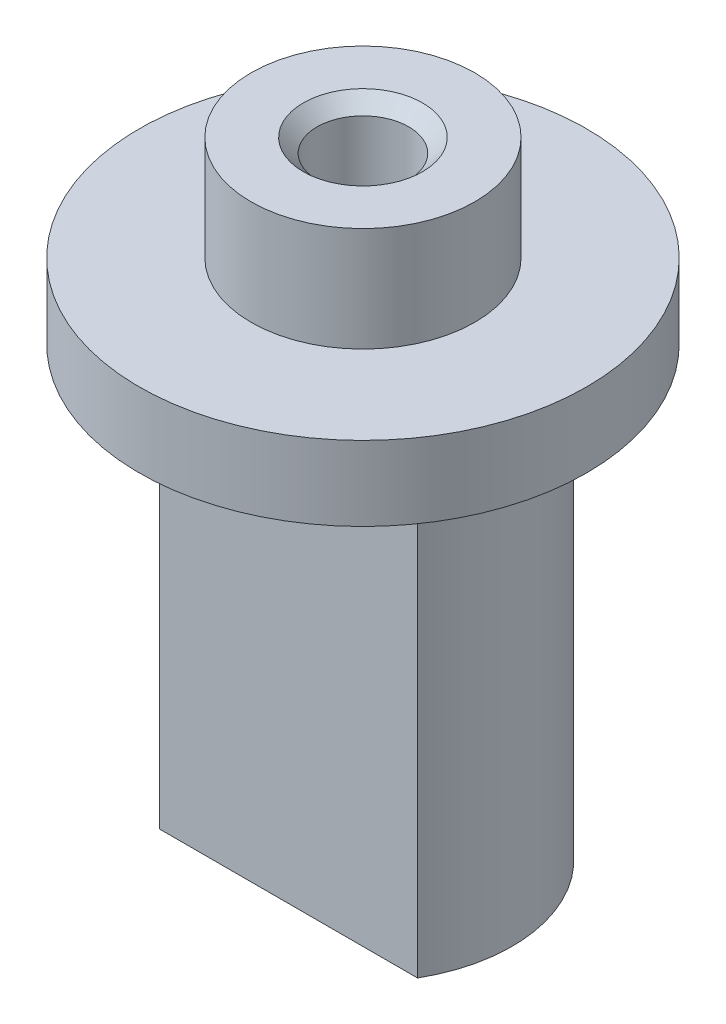
ISO-10303-21;
HEADER;
FILE_DESCRIPTION(('STEP AP214'),'2;1');
FILE_NAME('part.step','',(''),(''),'','','');
FILE_SCHEMA(('AUTOMOTIVE_DESIGN { 1 0 10303 214 1 1 1 1 }'));
ENDSEC;
DATA;
#1=APPLICATION_CONTEXT('core data for automotive mechanical design processes');
#2=APPLICATION_PROTOCOL_DEFINITION('international standard','automotive_design',2000,#1);
#3=PRODUCT_CONTEXT('',#1,'mechanical');
#4=PRODUCT('Part','Part','',(#3));
#5=PRODUCT_RELATED_PRODUCT_CATEGORY('part','',(#4));
#6=PRODUCT_DEFINITION_FORMATION('','',#4);
#7=PRODUCT_DEFINITION_CONTEXT('part definition',#1,'design');
#8=PRODUCT_DEFINITION('design','',#6,#7);
#9=PRODUCT_DEFINITION_SHAPE('','',#8);
#10=(LENGTH_UNIT() NAMED_UNIT(*) SI_UNIT(.MILLI.,.METRE.));
#11=(NAMED_UNIT(*) PLANE_ANGLE_UNIT() SI_UNIT($,.RADIAN.));
#12=(NAMED_UNIT(*) SI_UNIT($,.STERADIAN.) SOLID_ANGLE_UNIT());
#13=UNCERTAINTY_MEASURE_WITH_UNIT(LENGTH_MEASURE(1.E-05),#10,'distance_accuracy_value','');
#14=(GEOMETRIC_REPRESENTATION_CONTEXT(3) GLOBAL_UNCERTAINTY_ASSIGNED_CONTEXT((#13)) GLOBAL_UNIT_ASSIGNED_CONTEXT((#10,
#11,#12)) REPRESENTATION_CONTEXT('',''));
#15=CARTESIAN_POINT('',(0.,0.,0.));
#16=DIRECTION('',(0.,0.,1.));
#17=DIRECTION('',(1.,0.,0.));
#18=AXIS2_PLACEMENT_3D('',#15,#16,#17);
#19=CARTESIAN_POINT('',(0.,16.8000000000461,0.));
#20=DIRECTION('',(0.,1.,0.));
#21=DIRECTION('',(0.,0.,1.));
#22=AXIS2_PLACEMENT_3D('',#19,#20,#21);
#23=CONICAL_SURFACE('',#22,1.59999999982574,0.785398162553619);
#24=CARTESIAN_POINT('',(0.,16.4295,0.));
#25=DIRECTION('',(0.,1.,0.));
#26=DIRECTION('',(-1.,0.,0.));
#27=AXIS2_PLACEMENT_3D('',#24,#25,#26);
#28=CIRCLE('',#27,1.2295);
#29=CARTESIAN_POINT('',(-1.2295,16.4295,0.));
#30=VERTEX_POINT('',#29);
#31=EDGE_CURVE('E87',#30,#30,#28,.F.);
#32=ORIENTED_EDGE('',*,*,#31,.T.);
#33=EDGE_LOOP('',(#32));
#34=FACE_BOUND('',#33,.T.);
#35=CARTESIAN_POINT('',(0.,16.8000000001598,0.));
#36=DIRECTION('',(0.,1.,0.));
#37=DIRECTION('',(0.,0.,1.));
#38=AXIS2_PLACEMENT_3D('',#35,#36,#37);
#39=CIRCLE('',#38,1.59999999993943);
#40=CARTESIAN_POINT('',(0.,16.8000000001598,1.59999999993943));
#41=VERTEX_POINT('',#40);
#42=EDGE_CURVE('E20',#41,#41,#39,.F.);
#43=ORIENTED_EDGE('',*,*,#42,.F.);
#44=EDGE_LOOP('',(#43));
#45=FACE_BOUND('',#44,.T.);
#46=ADVANCED_FACE('F17',(#34,#45),#23,.F.);
#47=CARTESIAN_POINT('',(0.,12.8,0.));
#48=DIRECTION('',(0.,1.,0.));
#49=DIRECTION('',(-1.,0.,0.));
#50=AXIS2_PLACEMENT_3D('',#47,#48,#49);
#51=CYLINDRICAL_SURFACE('',#50,1.2295);
#52=CARTESIAN_POINT('',(0.,8.80000000074688,0.));
#53=DIRECTION('',(0.,1.,0.));
#54=DIRECTION('',(1.,0.,0.));
#55=AXIS2_PLACEMENT_3D('',#52,#53,#54);
#56=CIRCLE('',#55,1.22949999956745);
#57=CARTESIAN_POINT('',(1.22949999956745,8.80000000074688,0.));
#58=VERTEX_POINT('',#57);
#59=EDGE_CURVE('E82',#58,#58,#56,.F.);
#60=ORIENTED_EDGE('',*,*,#59,.T.);
#61=EDGE_LOOP('',(#60));
#62=FACE_BOUND('',#61,.T.);
#63=ORIENTED_EDGE('',*,*,#31,.F.);
#64=EDGE_LOOP('',(#63));
#65=FACE_BOUND('',#64,.T.);
#66=ADVANCED_FACE('F106',(#62,#65),#51,.F.);
#67=CARTESIAN_POINT('',(1.5,16.8,0.));
#68=DIRECTION('',(0.,1.,0.));
#69=DIRECTION('',(0.,0.,1.));
#70=AXIS2_PLACEMENT_3D('',#67,#68,#69);
#71=PLANE('',#70);
#72=ORIENTED_EDGE('',*,*,#42,.T.);
#73=EDGE_LOOP('',(#72));
#74=FACE_BOUND('',#73,.T.);
#75=CARTESIAN_POINT('',(0.,16.8,0.));
#76=DIRECTION('',(0.,-1.,0.));
#77=DIRECTION('',(1.,0.,0.));
#78=AXIS2_PLACEMENT_3D('',#75,#76,#77);
#79=CIRCLE('',#78,3.);
#80=CARTESIAN_POINT('',(3.,16.8,0.));
#81=VERTEX_POINT('',#80);
#82=EDGE_CURVE('E79',#81,#81,#79,.T.);
#83=ORIENTED_EDGE('',*,*,#82,.F.);
#84=EDGE_LOOP('',(#83));
#85=FACE_BOUND('',#84,.T.);
#86=ADVANCED_FACE('F103',(#74,#85),#71,.T.);
#87=CARTESIAN_POINT('',(0.,8.80000000069003,0.));
#88=DIRECTION('',(0.,1.,0.));
#89=DIRECTION('',(0.,0.,1.));
#90=AXIS2_PLACEMENT_3D('',#87,#88,#89);
#91=CONICAL_SURFACE('',#90,1.22949999945376,1.02974425749336);
#92=ORIENTED_EDGE('',*,*,#59,.F.);
#93=EDGE_LOOP('',(#92));
#94=FACE_BOUND('',#93,.T.);
#95=CARTESIAN_POINT('',(0.,8.40000000005148,0.));
#96=DIRECTION('',(0.,-1.,0.));
#97=DIRECTION('',(1.,0.,0.));
#98=AXIS2_PLACEMENT_3D('',#95,#96,#97);
#99=CIRCLE('',#98,0.563788207045945);
#100=CARTESIAN_POINT('',(0.563788207045945,8.40000000005148,0.));
#101=VERTEX_POINT('',#100);
#102=EDGE_CURVE('E76',#101,#101,#99,.T.);
#103=ORIENTED_EDGE('',*,*,#102,.T.);
#104=EDGE_LOOP('',(#103));
#105=FACE_BOUND('',#104,.T.);
#106=ADVANCED_FACE('F105',(#94,#105),#91,.F.);
#107=CARTESIAN_POINT('',(0.,15.4,0.));
#108=DIRECTION('',(0.,-1.,0.));
#109=DIRECTION('',(1.,0.,0.));
#110=AXIS2_PLACEMENT_3D('',#107,#108,#109);
#111=CYLINDRICAL_SURFACE('',#110,3.);
#112=ORIENTED_EDGE('',*,*,#82,.T.);
#113=EDGE_LOOP('',(#112));
#114=FACE_BOUND('',#113,.T.);
#115=CARTESIAN_POINT('',(0.,14.,0.));
#116=DIRECTION('',(0.,-1.,0.));
#117=DIRECTION('',(1.,0.,0.));
#118=AXIS2_PLACEMENT_3D('',#115,#116,#117);
#119=CIRCLE('',#118,3.);
#120=CARTESIAN_POINT('',(3.,14.,0.));
#121=VERTEX_POINT('',#120);
#122=EDGE_CURVE('E73',#121,#121,#119,.T.);
#123=ORIENTED_EDGE('',*,*,#122,.F.);
#124=EDGE_LOOP('',(#123));
#125=FACE_BOUND('',#124,.T.);
#126=ADVANCED_FACE('F100',(#114,#125),#111,.T.);
#127=CARTESIAN_POINT('',(0.,7.99999999929923,0.));
#128=DIRECTION('',(0.,-1.,0.));
#129=DIRECTION('',(0.,0.,-1.));
#130=AXIS2_PLACEMENT_3D('',#127,#128,#129);
#131=CONICAL_SURFACE('',#130,1.22949999945376,1.02974425750601);
#132=CARTESIAN_POINT('',(0.,8.,0.));
#133=DIRECTION('',(0.,-1.,0.));
#134=DIRECTION('',(1.,0.,0.));
#135=AXIS2_PLACEMENT_3D('',#132,#133,#134);
#136=CIRCLE('',#135,1.2295);
#137=CARTESIAN_POINT('',(1.2295,8.,0.));
#138=VERTEX_POINT('',#137);
#139=EDGE_CURVE('E70',#138,#138,#136,.T.);
#140=ORIENTED_EDGE('',*,*,#139,.T.);
#141=EDGE_LOOP('',(#140));
#142=FACE_BOUND('',#141,.T.);
#143=ORIENTED_EDGE('',*,*,#102,.F.);
#144=EDGE_LOOP('',(#143));
#145=FACE_BOUND('',#144,.T.);
#146=ADVANCED_FACE('F146',(#142,#145),#131,.F.);
#147=CARTESIAN_POINT('',(4.5,14.,0.));
#148=DIRECTION('',(0.,1.,0.));
#149=DIRECTION('',(0.,0.,1.));
#150=AXIS2_PLACEMENT_3D('',#147,#148,#149);
#151=PLANE('',#150);
#152=ORIENTED_EDGE('',*,*,#122,.T.);
#153=EDGE_LOOP('',(#152));
#154=FACE_BOUND('',#153,.T.);
#155=CARTESIAN_POINT('',(0.,14.,0.));
#156=DIRECTION('',(0.,-1.,0.));
#157=DIRECTION('',(1.,0.,0.));
#158=AXIS2_PLACEMENT_3D('',#155,#156,#157);
#159=CIRCLE('',#158,6.);
#160=CARTESIAN_POINT('',(6.,14.,0.));
#161=VERTEX_POINT('',#160);
#162=EDGE_CURVE('E67',#161,#161,#159,.T.);
#163=ORIENTED_EDGE('',*,*,#162,.F.);
#164=EDGE_LOOP('',(#163));
#165=FACE_BOUND('',#164,.T.);
#166=ADVANCED_FACE('F142',(#154,#165),#151,.T.);
#167=CARTESIAN_POINT('',(0.,4.,0.));
#168=DIRECTION('',(0.,-1.,0.));
#169=DIRECTION('',(1.,0.,0.));
#170=AXIS2_PLACEMENT_3D('',#167,#168,#169);
#171=CYLINDRICAL_SURFACE('',#170,1.2295);
#172=ORIENTED_EDGE('',*,*,#139,.F.);
#173=EDGE_LOOP('',(#172));
#174=FACE_BOUND('',#173,.T.);
#175=CARTESIAN_POINT('',(0.,0.370500000201446,0.));
#176=DIRECTION('',(0.,-1.,0.));
#177=DIRECTION('',(1.,0.,0.));
#178=AXIS2_PLACEMENT_3D('',#175,#176,#177);
#179=CIRCLE('',#178,1.22950000013589);
#180=CARTESIAN_POINT('',(1.22950000013589,0.370500000201446,0.));
#181=VERTEX_POINT('',#180);
#182=EDGE_CURVE('E64',#181,#181,#179,.T.);
#183=ORIENTED_EDGE('',*,*,#182,.T.);
#184=EDGE_LOOP('',(#183));
#185=FACE_BOUND('',#184,.T.);
#186=ADVANCED_FACE('F138',(#174,#185),#171,.F.);
#187=CARTESIAN_POINT('',(0.,13.,0.));
#188=DIRECTION('',(0.,-1.,0.));
#189=DIRECTION('',(1.,0.,0.));
#190=AXIS2_PLACEMENT_3D('',#187,#188,#189);
#191=CYLINDRICAL_SURFACE('',#190,6.);
#192=ORIENTED_EDGE('',*,*,#162,.T.);
#193=EDGE_LOOP('',(#192));
#194=FACE_BOUND('',#193,.T.);
#195=CARTESIAN_POINT('',(0.,12.,0.));
#196=DIRECTION('',(0.,-1.,0.));
#197=DIRECTION('',(1.,0.,0.));
#198=AXIS2_PLACEMENT_3D('',#195,#196,#197);
#199=CIRCLE('',#198,6.);
#200=CARTESIAN_POINT('',(6.,12.,0.));
#201=VERTEX_POINT('',#200);
#202=EDGE_CURVE('E49',#201,#201,#199,.T.);
#203=ORIENTED_EDGE('',*,*,#202,.F.);
#204=EDGE_LOOP('',(#203));
#205=FACE_BOUND('',#204,.T.);
#206=ADVANCED_FACE('F134',(#194,#205),#191,.T.);
#207=CARTESIAN_POINT('',(0.,0.,0.));
#208=DIRECTION('',(0.,-1.,0.));
#209=DIRECTION('',(1.,0.,0.));
#210=AXIS2_PLACEMENT_3D('',#207,#208,#209);
#211=CONICAL_SURFACE('',#210,1.59999999965521,0.785398162476907);
#212=ORIENTED_EDGE('',*,*,#182,.F.);
#213=EDGE_LOOP('',(#212));
#214=FACE_BOUND('',#213,.T.);
#215=CARTESIAN_POINT('',(0.,-1.70530256582424E-10,0.));
#216=DIRECTION('',(0.,-1.,0.));
#217=DIRECTION('',(1.,0.,0.));
#218=AXIS2_PLACEMENT_3D('',#215,#216,#217);
#219=CIRCLE('',#218,1.59999999982574);
#220=CARTESIAN_POINT('',(1.59999999982574,-1.70530256582424E-10,0.));
#221=VERTEX_POINT('',#220);
#222=EDGE_CURVE('E57',#221,#221,#219,.F.);
#223=ORIENTED_EDGE('',*,*,#222,.F.);
#224=EDGE_LOOP('',(#223));
#225=FACE_BOUND('',#224,.T.);
#226=ADVANCED_FACE('F131',(#214,#225),#211,.F.);
#227=CARTESIAN_POINT('',(5.,12.,0.));
#228=DIRECTION('',(0.,-1.,0.));
#229=DIRECTION('',(0.,0.,-1.));
#230=AXIS2_PLACEMENT_3D('',#227,#228,#229);
#231=PLANE('',#230);
#232=CARTESIAN_POINT('',(0.,12.,0.));
#233=DIRECTION('',(0.,-1.,0.));
#234=DIRECTION('',(1.,0.,0.));
#235=AXIS2_PLACEMENT_3D('',#232,#233,#234);
#236=CIRCLE('',#235,4.);
#237=CARTESIAN_POINT('',(-3.46410161513775,12.,2.));
#238=VERTEX_POINT('',#237);
#239=CARTESIAN_POINT('',(3.46410161513775,12.,2.));
#240=VERTEX_POINT('',#239);
#241=EDGE_CURVE('E51',#238,#240,#236,.T.);
#242=ORIENTED_EDGE('',*,*,#241,.F.);
#243=DIRECTION('',(-1.,0.,0.));
#244=VECTOR('',#243,1.);
#245=CARTESIAN_POINT('',(-3.46410161513775,12.,2.));
#246=LINE('',#245,#244);
#247=EDGE_CURVE('E41',#238,#240,#246,.F.);
#248=ORIENTED_EDGE('',*,*,#247,.T.);
#249=EDGE_LOOP('',(#242,#248));
#250=FACE_BOUND('',#249,.T.);
#251=ORIENTED_EDGE('',*,*,#202,.T.);
#252=EDGE_LOOP('',(#251));
#253=FACE_BOUND('',#252,.T.);
#254=ADVANCED_FACE('F52',(#250,#253),#231,.T.);
#255=CARTESIAN_POINT('',(-3.46410161513775,0.,2.));
#256=DIRECTION('',(0.,0.,-1.));
#257=DIRECTION('',(-1.,0.,0.));
#258=AXIS2_PLACEMENT_3D('',#255,#256,#257);
#259=PLANE('',#258);
#260=DIRECTION('',(0.,-1.,0.));
#261=VECTOR('',#260,1.);
#262=CARTESIAN_POINT('',(-3.46410161513775,6.,2.));
#263=LINE('',#262,#261);
#264=CARTESIAN_POINT('',(-3.46410161513775,0.,2.));
#265=VERTEX_POINT('',#264);
#266=EDGE_CURVE('E45',#265,#238,#263,.F.);
#267=ORIENTED_EDGE('',*,*,#266,.F.);
#268=DIRECTION('',(1.,0.,0.));
#269=VECTOR('',#268,1.);
#270=CARTESIAN_POINT('',(2.,0.,2.));
#271=LINE('',#270,#269);
#272=CARTESIAN_POINT('',(3.46410161513775,0.,2.));
#273=VERTEX_POINT('',#272);
#274=EDGE_CURVE('E34',#273,#265,#271,.F.);
#275=ORIENTED_EDGE('',*,*,#274,.F.);
#276=DIRECTION('',(0.,-1.,0.));
#277=VECTOR('',#276,1.);
#278=CARTESIAN_POINT('',(3.46410161513775,6.,2.));
#279=LINE('',#278,#277);
#280=EDGE_CURVE('E26',#240,#273,#279,.T.);
#281=ORIENTED_EDGE('',*,*,#280,.F.);
#282=ORIENTED_EDGE('',*,*,#247,.F.);
#283=EDGE_LOOP('',(#267,#275,#281,#282));
#284=FACE_BOUND('',#283,.T.);
#285=ADVANCED_FACE('F43',(#284),#259,.F.);
#286=CARTESIAN_POINT('',(2.,0.,0.));
#287=DIRECTION('',(0.,-1.,0.));
#288=DIRECTION('',(0.,0.,-1.));
#289=AXIS2_PLACEMENT_3D('',#286,#287,#288);
#290=PLANE('',#289);
#291=ORIENTED_EDGE('',*,*,#222,.T.);
#292=EDGE_LOOP('',(#291));
#293=FACE_BOUND('',#292,.T.);
#294=ORIENTED_EDGE('',*,*,#274,.T.);
#295=CARTESIAN_POINT('',(0.,0.,0.));
#296=DIRECTION('',(0.,-1.,0.));
#297=DIRECTION('',(1.,0.,0.));
#298=AXIS2_PLACEMENT_3D('',#295,#296,#297);
#299=CIRCLE('',#298,4.);
#300=EDGE_CURVE('E11',#273,#265,#299,.F.);
#301=ORIENTED_EDGE('',*,*,#300,.F.);
#302=EDGE_LOOP('',(#294,#301));
#303=FACE_BOUND('',#302,.T.);
#304=ADVANCED_FACE('F119',(#293,#303),#290,.T.);
#305=CARTESIAN_POINT('',(0.,6.,0.));
#306=DIRECTION('',(0.,-1.,0.));
#307=DIRECTION('',(1.,0.,0.));
#308=AXIS2_PLACEMENT_3D('',#305,#306,#307);
#309=CYLINDRICAL_SURFACE('',#308,4.);
#310=ORIENTED_EDGE('',*,*,#280,.T.);
#311=ORIENTED_EDGE('',*,*,#300,.T.);
#312=ORIENTED_EDGE('',*,*,#266,.T.);
#313=ORIENTED_EDGE('',*,*,#241,.T.);
#314=EDGE_LOOP('',(#310,#311,#312,#313));
#315=FACE_BOUND('',#314,.T.);
#316=ADVANCED_FACE('F56',(#315),#309,.T.);
#317=CLOSED_SHELL('',(#46,#66,#86,#106,#126,#146,#166,#186,#206,#226,#254,#285,#304,#316));
#318=MANIFOLD_SOLID_BREP('B1',#317);
#319=ADVANCED_BREP_SHAPE_REPRESENTATION('',(#18,#318),#14);
#320=SHAPE_DEFINITION_REPRESENTATION(#9,#319);
ENDSEC;
END-ISO-10303-21;
